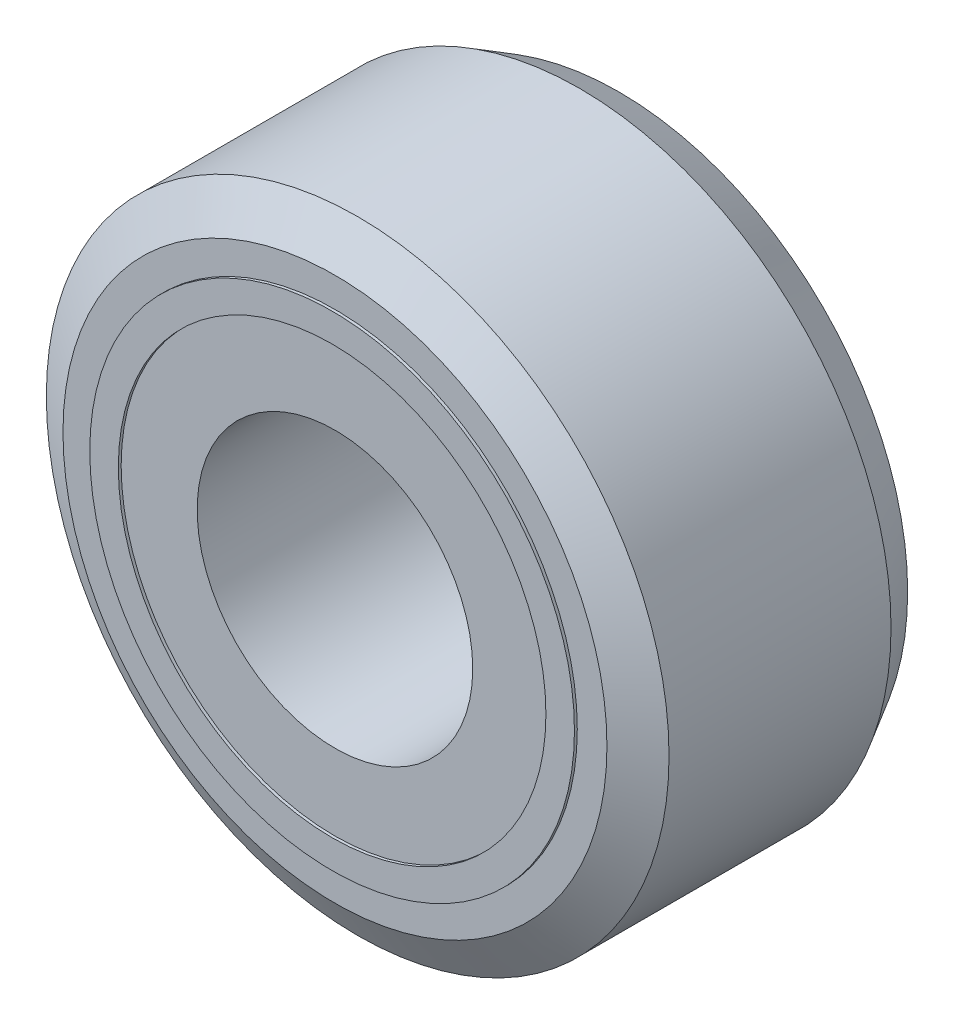
ISO-10303-21;
HEADER;
FILE_DESCRIPTION(('STEP AP214'),'2;1');
FILE_NAME('part.step','',(''),(''),'','','');
FILE_SCHEMA(('AUTOMOTIVE_DESIGN { 1 0 10303 214 1 1 1 1 }'));
ENDSEC;
DATA;
#1=APPLICATION_CONTEXT('core data for automotive mechanical design processes');
#2=APPLICATION_PROTOCOL_DEFINITION('international standard','automotive_design',2000,#1);
#3=PRODUCT_CONTEXT('',#1,'mechanical');
#4=PRODUCT('Part','Part','',(#3));
#5=PRODUCT_RELATED_PRODUCT_CATEGORY('part','',(#4));
#6=PRODUCT_DEFINITION_FORMATION('','',#4);
#7=PRODUCT_DEFINITION_CONTEXT('part definition',#1,'design');
#8=PRODUCT_DEFINITION('design','',#6,#7);
#9=PRODUCT_DEFINITION_SHAPE('','',#8);
#10=(LENGTH_UNIT() NAMED_UNIT(*) SI_UNIT(.MILLI.,.METRE.));
#11=(NAMED_UNIT(*) PLANE_ANGLE_UNIT() SI_UNIT($,.RADIAN.));
#12=(NAMED_UNIT(*) SI_UNIT($,.STERADIAN.) SOLID_ANGLE_UNIT());
#13=UNCERTAINTY_MEASURE_WITH_UNIT(LENGTH_MEASURE(1.E-05),#10,'distance_accuracy_value','');
#14=(GEOMETRIC_REPRESENTATION_CONTEXT(3) GLOBAL_UNCERTAINTY_ASSIGNED_CONTEXT((#13)) GLOBAL_UNIT_ASSIGNED_CONTEXT((#10,
#11,#12)) REPRESENTATION_CONTEXT('',''));
#15=CARTESIAN_POINT('',(0.,0.,0.));
#16=DIRECTION('',(0.,0.,1.));
#17=DIRECTION('',(1.,0.,0.));
#18=AXIS2_PLACEMENT_3D('',#15,#16,#17);
#19=CARTESIAN_POINT('',(0.,0.,2.5));
#20=DIRECTION('',(0.,0.,1.));
#21=DIRECTION('',(1.,0.,0.));
#22=AXIS2_PLACEMENT_3D('',#19,#20,#21);
#23=PLANE('',#22);
#24=CARTESIAN_POINT('',(0.,0.,2.5));
#25=DIRECTION('',(0.,0.,1.));
#26=DIRECTION('',(1.,0.,0.));
#27=AXIS2_PLACEMENT_3D('',#24,#25,#26);
#28=CIRCLE('',#27,4.26522152822671);
#29=CARTESIAN_POINT('',(4.26522152822671,0.,2.5));
#30=VERTEX_POINT('',#29);
#31=EDGE_CURVE('E52',#30,#30,#28,.F.);
#32=ORIENTED_EDGE('',*,*,#31,.T.);
#33=EDGE_LOOP('',(#32));
#34=FACE_BOUND('',#33,.T.);
#35=CARTESIAN_POINT('',(0.,0.,2.5));
#36=DIRECTION('',(0.,0.,1.));
#37=DIRECTION('',(1.,0.,0.));
#38=AXIS2_PLACEMENT_3D('',#35,#36,#37);
#39=CIRCLE('',#38,4.78717967697245);
#40=CARTESIAN_POINT('',(4.78717967697245,0.,2.5));
#41=VERTEX_POINT('',#40);
#42=EDGE_CURVE('E47',#41,#41,#39,.T.);
#43=ORIENTED_EDGE('',*,*,#42,.T.);
#44=EDGE_LOOP('',(#43));
#45=FACE_BOUND('',#44,.T.);
#46=ADVANCED_FACE('F34',(#34,#45),#23,.T.);
#47=CARTESIAN_POINT('',(0.,0.,-2.5));
#48=DIRECTION('',(0.,0.,1.));
#49=DIRECTION('',(1.,0.,0.));
#50=AXIS2_PLACEMENT_3D('',#47,#48,#49);
#51=PLANE('',#50);
#52=CARTESIAN_POINT('',(0.,0.,-2.5));
#53=DIRECTION('',(0.,0.,1.));
#54=DIRECTION('',(1.,0.,0.));
#55=AXIS2_PLACEMENT_3D('',#52,#53,#54);
#56=CIRCLE('',#55,4.26522152822671);
#57=CARTESIAN_POINT('',(4.26522152822671,0.,-2.5));
#58=VERTEX_POINT('',#57);
#59=EDGE_CURVE('E39',#58,#58,#56,.F.);
#60=ORIENTED_EDGE('',*,*,#59,.F.);
#61=EDGE_LOOP('',(#60));
#62=FACE_BOUND('',#61,.T.);
#63=CARTESIAN_POINT('',(0.,0.,-2.5));
#64=DIRECTION('',(0.,0.,1.));
#65=DIRECTION('',(1.,0.,0.));
#66=AXIS2_PLACEMENT_3D('',#63,#64,#65);
#67=CIRCLE('',#66,5.08);
#68=CARTESIAN_POINT('',(5.08,0.,-2.5));
#69=VERTEX_POINT('',#68);
#70=EDGE_CURVE('E68',#69,#69,#67,.F.);
#71=ORIENTED_EDGE('',*,*,#70,.T.);
#72=EDGE_LOOP('',(#71));
#73=FACE_BOUND('',#72,.T.);
#74=ADVANCED_FACE('F107',(#62,#73),#51,.F.);
#75=CARTESIAN_POINT('',(0.,0.,2.5));
#76=DIRECTION('',(0.,0.,-1.));
#77=DIRECTION('',(-1.,0.,0.));
#78=AXIS2_PLACEMENT_3D('',#75,#76,#77);
#79=CYLINDRICAL_SURFACE('',#78,5.48);
#80=CARTESIAN_POINT('',(0.,0.,-1.80717967697244));
#81=DIRECTION('',(0.,0.,1.));
#82=DIRECTION('',(1.,0.,0.));
#83=AXIS2_PLACEMENT_3D('',#80,#81,#82);
#84=CIRCLE('',#83,5.48);
#85=CARTESIAN_POINT('',(5.48,0.,-1.80717967697244));
#86=VERTEX_POINT('',#85);
#87=EDGE_CURVE('E65',#86,#86,#84,.T.);
#88=ORIENTED_EDGE('',*,*,#87,.T.);
#89=EDGE_LOOP('',(#88));
#90=FACE_BOUND('',#89,.T.);
#91=CARTESIAN_POINT('',(0.,0.,2.1));
#92=DIRECTION('',(0.,0.,1.));
#93=DIRECTION('',(1.,0.,0.));
#94=AXIS2_PLACEMENT_3D('',#91,#92,#93);
#95=CIRCLE('',#94,5.48);
#96=CARTESIAN_POINT('',(5.48,0.,2.1));
#97=VERTEX_POINT('',#96);
#98=EDGE_CURVE('E60',#97,#97,#95,.F.);
#99=ORIENTED_EDGE('',*,*,#98,.T.);
#100=EDGE_LOOP('',(#99));
#101=FACE_BOUND('',#100,.T.);
#102=ADVANCED_FACE('F114',(#90,#101),#79,.T.);
#103=CARTESIAN_POINT('',(0.,0.,-1.80717967697244));
#104=DIRECTION('',(0.,0.,1.));
#105=DIRECTION('',(1.,0.,0.));
#106=AXIS2_PLACEMENT_3D('',#103,#104,#105);
#107=CONICAL_SURFACE('',#106,5.48,0.523598775598299);
#108=ORIENTED_EDGE('',*,*,#70,.F.);
#109=EDGE_LOOP('',(#108));
#110=FACE_BOUND('',#109,.T.);
#111=ORIENTED_EDGE('',*,*,#87,.F.);
#112=EDGE_LOOP('',(#111));
#113=FACE_BOUND('',#112,.T.);
#114=ADVANCED_FACE('F138',(#110,#113),#107,.T.);
#115=CARTESIAN_POINT('',(0.,0.,2.5));
#116=DIRECTION('',(0.,0.,-1.));
#117=DIRECTION('',(-1.,0.,0.));
#118=AXIS2_PLACEMENT_3D('',#115,#116,#117);
#119=CONICAL_SURFACE('',#118,4.78717967697245,1.0471975511966);
#120=ORIENTED_EDGE('',*,*,#98,.F.);
#121=EDGE_LOOP('',(#120));
#122=FACE_BOUND('',#121,.T.);
#123=ORIENTED_EDGE('',*,*,#42,.F.);
#124=EDGE_LOOP('',(#123));
#125=FACE_BOUND('',#124,.T.);
#126=ADVANCED_FACE('F37',(#122,#125),#119,.T.);
#127=CARTESIAN_POINT('',(0.,0.,-2.55));
#128=DIRECTION('',(0.,0.,1.));
#129=DIRECTION('',(1.,0.,0.));
#130=AXIS2_PLACEMENT_3D('',#127,#128,#129);
#131=CYLINDRICAL_SURFACE('',#130,4.26522152822671);
#132=CARTESIAN_POINT('',(0.,0.,-2.55));
#133=DIRECTION('',(0.,0.,-1.));
#134=DIRECTION('',(-1.,0.,0.));
#135=AXIS2_PLACEMENT_3D('',#132,#133,#134);
#136=CIRCLE('',#135,4.26522152822671);
#137=CARTESIAN_POINT('',(-4.26522152822671,0.,-2.55));
#138=VERTEX_POINT('',#137);
#139=EDGE_CURVE('E73',#138,#138,#136,.T.);
#140=ORIENTED_EDGE('',*,*,#139,.F.);
#141=EDGE_LOOP('',(#140));
#142=FACE_BOUND('',#141,.T.);
#143=ORIENTED_EDGE('',*,*,#59,.T.);
#144=EDGE_LOOP('',(#143));
#145=FACE_BOUND('',#144,.T.);
#146=ADVANCED_FACE('F93',(#142,#145),#131,.T.);
#147=CARTESIAN_POINT('',(0.,0.,-2.55));
#148=DIRECTION('',(0.,0.,-1.));
#149=DIRECTION('',(-1.,0.,0.));
#150=AXIS2_PLACEMENT_3D('',#147,#148,#149);
#151=PLANE('',#150);
#152=ORIENTED_EDGE('',*,*,#139,.T.);
#153=EDGE_LOOP('',(#152));
#154=FACE_BOUND('',#153,.T.);
#155=CARTESIAN_POINT('',(0.,0.,-2.55));
#156=DIRECTION('',(0.,0.,-1.));
#157=DIRECTION('',(-1.,0.,0.));
#158=AXIS2_PLACEMENT_3D('',#155,#156,#157);
#159=CIRCLE('',#158,3.76303741023646);
#160=CARTESIAN_POINT('',(-3.76303741023646,0.,-2.55));
#161=VERTEX_POINT('',#160);
#162=EDGE_CURVE('E80',#161,#161,#159,.T.);
#163=ORIENTED_EDGE('',*,*,#162,.F.);
#164=EDGE_LOOP('',(#163));
#165=FACE_BOUND('',#164,.T.);
#166=ADVANCED_FACE('F91',(#154,#165),#151,.T.);
#167=CARTESIAN_POINT('',(0.,0.,-2.55));
#168=DIRECTION('',(0.,0.,1.));
#169=DIRECTION('',(1.,0.,0.));
#170=AXIS2_PLACEMENT_3D('',#167,#168,#169);
#171=CYLINDRICAL_SURFACE('',#170,3.76303741023646);
#172=ORIENTED_EDGE('',*,*,#162,.T.);
#173=EDGE_LOOP('',(#172));
#174=FACE_BOUND('',#173,.T.);
#175=CARTESIAN_POINT('',(0.,0.,-2.5));
#176=DIRECTION('',(0.,0.,1.));
#177=DIRECTION('',(1.,0.,0.));
#178=AXIS2_PLACEMENT_3D('',#175,#176,#177);
#179=CIRCLE('',#178,3.76303741023646);
#180=CARTESIAN_POINT('',(3.76303741023646,0.,-2.5));
#181=VERTEX_POINT('',#180);
#182=EDGE_CURVE('E56',#181,#181,#179,.F.);
#183=ORIENTED_EDGE('',*,*,#182,.F.);
#184=EDGE_LOOP('',(#183));
#185=FACE_BOUND('',#184,.T.);
#186=ADVANCED_FACE('F88',(#174,#185),#171,.F.);
#187=CARTESIAN_POINT('',(0.,0.,2.55));
#188=DIRECTION('',(0.,0.,-1.));
#189=DIRECTION('',(-1.,0.,0.));
#190=AXIS2_PLACEMENT_3D('',#187,#188,#189);
#191=PLANE('',#190);
#192=CARTESIAN_POINT('',(0.,0.,2.55));
#193=DIRECTION('',(0.,0.,-1.));
#194=DIRECTION('',(-1.,0.,0.));
#195=AXIS2_PLACEMENT_3D('',#192,#193,#194);
#196=CIRCLE('',#195,4.26522152822671);
#197=CARTESIAN_POINT('',(-4.26522152822671,0.,2.55));
#198=VERTEX_POINT('',#197);
#199=EDGE_CURVE('E50',#198,#198,#196,.T.);
#200=ORIENTED_EDGE('',*,*,#199,.F.);
#201=EDGE_LOOP('',(#200));
#202=FACE_BOUND('',#201,.T.);
#203=CARTESIAN_POINT('',(0.,0.,2.55));
#204=DIRECTION('',(0.,0.,-1.));
#205=DIRECTION('',(-1.,0.,0.));
#206=AXIS2_PLACEMENT_3D('',#203,#204,#205);
#207=CIRCLE('',#206,3.76303741023646);
#208=CARTESIAN_POINT('',(-3.76303741023646,0.,2.55));
#209=VERTEX_POINT('',#208);
#210=EDGE_CURVE('E82',#209,#209,#207,.T.);
#211=ORIENTED_EDGE('',*,*,#210,.T.);
#212=EDGE_LOOP('',(#211));
#213=FACE_BOUND('',#212,.T.);
#214=ADVANCED_FACE('F99',(#202,#213),#191,.F.);
#215=ORIENTED_EDGE('',*,*,#31,.F.);
#216=EDGE_LOOP('',(#215));
#217=FACE_BOUND('',#216,.T.);
#218=ORIENTED_EDGE('',*,*,#199,.T.);
#219=EDGE_LOOP('',(#218));
#220=FACE_BOUND('',#219,.T.);
#221=ADVANCED_FACE('F104',(#217,#220),#131,.T.);
#222=CARTESIAN_POINT('',(0.,0.,2.5));
#223=DIRECTION('',(0.,0.,1.));
#224=DIRECTION('',(1.,0.,0.));
#225=AXIS2_PLACEMENT_3D('',#222,#223,#224);
#226=CIRCLE('',#225,3.76303741023646);
#227=CARTESIAN_POINT('',(3.76303741023646,0.,2.5));
#228=VERTEX_POINT('',#227);
#229=EDGE_CURVE('E10',#228,#228,#226,.F.);
#230=ORIENTED_EDGE('',*,*,#229,.T.);
#231=EDGE_LOOP('',(#230));
#232=FACE_BOUND('',#231,.T.);
#233=ORIENTED_EDGE('',*,*,#210,.F.);
#234=EDGE_LOOP('',(#233));
#235=FACE_BOUND('',#234,.T.);
#236=ADVANCED_FACE('F101',(#232,#235),#171,.F.);
#237=CARTESIAN_POINT('',(0.,0.,2.5));
#238=DIRECTION('',(0.,0.,1.));
#239=DIRECTION('',(1.,0.,0.));
#240=AXIS2_PLACEMENT_3D('',#237,#238,#239);
#241=CIRCLE('',#240,2.425);
#242=CARTESIAN_POINT('',(2.425,0.,2.5));
#243=VERTEX_POINT('',#242);
#244=EDGE_CURVE('E57',#243,#243,#241,.T.);
#245=ORIENTED_EDGE('',*,*,#244,.F.);
#246=EDGE_LOOP('',(#245));
#247=FACE_BOUND('',#246,.T.);
#248=ORIENTED_EDGE('',*,*,#229,.F.);
#249=EDGE_LOOP('',(#248));
#250=FACE_BOUND('',#249,.T.);
#251=ADVANCED_FACE('F110',(#247,#250),#23,.T.);
#252=CARTESIAN_POINT('',(0.,0.,2.5));
#253=DIRECTION('',(0.,0.,-1.));
#254=DIRECTION('',(-1.,0.,0.));
#255=AXIS2_PLACEMENT_3D('',#252,#253,#254);
#256=CYLINDRICAL_SURFACE('',#255,2.425);
#257=ORIENTED_EDGE('',*,*,#244,.T.);
#258=EDGE_LOOP('',(#257));
#259=FACE_BOUND('',#258,.T.);
#260=CARTESIAN_POINT('',(0.,0.,-2.5));
#261=DIRECTION('',(0.,0.,1.));
#262=DIRECTION('',(1.,0.,0.));
#263=AXIS2_PLACEMENT_3D('',#260,#261,#262);
#264=CIRCLE('',#263,2.425);
#265=CARTESIAN_POINT('',(2.425,0.,-2.5));
#266=VERTEX_POINT('',#265);
#267=EDGE_CURVE('E55',#266,#266,#264,.T.);
#268=ORIENTED_EDGE('',*,*,#267,.F.);
#269=EDGE_LOOP('',(#268));
#270=FACE_BOUND('',#269,.T.);
#271=ADVANCED_FACE('F121',(#259,#270),#256,.F.);
#272=ORIENTED_EDGE('',*,*,#267,.T.);
#273=EDGE_LOOP('',(#272));
#274=FACE_BOUND('',#273,.T.);
#275=ORIENTED_EDGE('',*,*,#182,.T.);
#276=EDGE_LOOP('',(#275));
#277=FACE_BOUND('',#276,.T.);
#278=ADVANCED_FACE('F117',(#274,#277),#51,.F.);
#279=CLOSED_SHELL('',(#46,#74,#102,#114,#126,#146,#166,#186,#214,#221,#236,#251,#271,#278));
#280=MANIFOLD_SOLID_BREP('B2',#279);
#281=ADVANCED_BREP_SHAPE_REPRESENTATION('',(#18,#280),#14);
#282=SHAPE_DEFINITION_REPRESENTATION(#9,#281);
ENDSEC;
END-ISO-10303-21;
